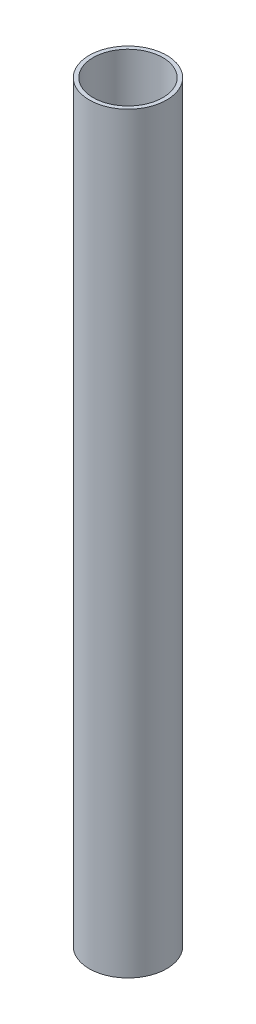
ISO-10303-21;
HEADER;
FILE_DESCRIPTION(('STEP AP214'),'2;1');
FILE_NAME('part.step','',(''),(''),'','','');
FILE_SCHEMA(('AUTOMOTIVE_DESIGN { 1 0 10303 214 1 1 1 1 }'));
ENDSEC;
DATA;
#1=APPLICATION_CONTEXT('core data for automotive mechanical design processes');
#2=APPLICATION_PROTOCOL_DEFINITION('international standard','automotive_design',2000,#1);
#3=PRODUCT_CONTEXT('',#1,'mechanical');
#4=PRODUCT('Part','Part','',(#3));
#5=PRODUCT_RELATED_PRODUCT_CATEGORY('part','',(#4));
#6=PRODUCT_DEFINITION_FORMATION('','',#4);
#7=PRODUCT_DEFINITION_CONTEXT('part definition',#1,'design');
#8=PRODUCT_DEFINITION('design','',#6,#7);
#9=PRODUCT_DEFINITION_SHAPE('','',#8);
#10=(LENGTH_UNIT() NAMED_UNIT(*) SI_UNIT(.MILLI.,.METRE.));
#11=(NAMED_UNIT(*) PLANE_ANGLE_UNIT() SI_UNIT($,.RADIAN.));
#12=(NAMED_UNIT(*) SI_UNIT($,.STERADIAN.) SOLID_ANGLE_UNIT());
#13=UNCERTAINTY_MEASURE_WITH_UNIT(LENGTH_MEASURE(1.E-05),#10,'distance_accuracy_value','');
#14=(GEOMETRIC_REPRESENTATION_CONTEXT(3) GLOBAL_UNCERTAINTY_ASSIGNED_CONTEXT((#13)) GLOBAL_UNIT_ASSIGNED_CONTEXT((#10,
#11,#12)) REPRESENTATION_CONTEXT('',''));
#15=CARTESIAN_POINT('',(0.,0.,0.));
#16=DIRECTION('',(0.,0.,1.));
#17=DIRECTION('',(1.,0.,0.));
#18=AXIS2_PLACEMENT_3D('',#15,#16,#17);
#19=CARTESIAN_POINT('',(0.,240.,0.));
#20=DIRECTION('',(0.,1.,0.));
#21=DIRECTION('',(0.,0.,1.));
#22=AXIS2_PLACEMENT_3D('',#19,#20,#21);
#23=PLANE('',#22);
#24=CARTESIAN_POINT('',(0.,240.,0.));
#25=DIRECTION('',(0.,1.,0.));
#26=DIRECTION('',(0.,0.,1.));
#27=AXIS2_PLACEMENT_3D('',#24,#25,#26);
#28=CIRCLE('',#27,12.35);
#29=CARTESIAN_POINT('',(0.,240.,12.35));
#30=VERTEX_POINT('',#29);
#31=EDGE_CURVE('E10',#30,#30,#28,.T.);
#32=ORIENTED_EDGE('',*,*,#31,.T.);
#33=EDGE_LOOP('',(#32));
#34=FACE_BOUND('',#33,.T.);
#35=CARTESIAN_POINT('',(0.,240.,0.));
#36=DIRECTION('',(0.,1.,0.));
#37=DIRECTION('',(0.,0.,1.));
#38=AXIS2_PLACEMENT_3D('',#35,#36,#37);
#39=CIRCLE('',#38,11.1);
#40=CARTESIAN_POINT('',(0.,240.,11.1));
#41=VERTEX_POINT('',#40);
#42=EDGE_CURVE('E41',#41,#41,#39,.T.);
#43=ORIENTED_EDGE('',*,*,#42,.F.);
#44=EDGE_LOOP('',(#43));
#45=FACE_BOUND('',#44,.T.);
#46=ADVANCED_FACE('F30',(#34,#45),#23,.T.);
#47=CARTESIAN_POINT('',(0.,0.,0.));
#48=DIRECTION('',(0.,1.,0.));
#49=DIRECTION('',(0.,0.,1.));
#50=AXIS2_PLACEMENT_3D('',#47,#48,#49);
#51=PLANE('',#50);
#52=CARTESIAN_POINT('',(0.,0.,0.));
#53=DIRECTION('',(0.,1.,0.));
#54=DIRECTION('',(0.,0.,1.));
#55=AXIS2_PLACEMENT_3D('',#52,#53,#54);
#56=CIRCLE('',#55,12.35);
#57=CARTESIAN_POINT('',(0.,0.,12.35));
#58=VERTEX_POINT('',#57);
#59=EDGE_CURVE('E34',#58,#58,#56,.T.);
#60=ORIENTED_EDGE('',*,*,#59,.F.);
#61=EDGE_LOOP('',(#60));
#62=FACE_BOUND('',#61,.T.);
#63=CARTESIAN_POINT('',(0.,0.,0.));
#64=DIRECTION('',(0.,1.,0.));
#65=DIRECTION('',(0.,0.,1.));
#66=AXIS2_PLACEMENT_3D('',#63,#64,#65);
#67=CIRCLE('',#66,11.1);
#68=CARTESIAN_POINT('',(0.,0.,11.1));
#69=VERTEX_POINT('',#68);
#70=EDGE_CURVE('E43',#69,#69,#67,.T.);
#71=ORIENTED_EDGE('',*,*,#70,.T.);
#72=EDGE_LOOP('',(#71));
#73=FACE_BOUND('',#72,.T.);
#74=ADVANCED_FACE('F53',(#62,#73),#51,.F.);
#75=CARTESIAN_POINT('',(0.,240.,0.));
#76=DIRECTION('',(0.,-1.,0.));
#77=DIRECTION('',(0.,0.,-1.));
#78=AXIS2_PLACEMENT_3D('',#75,#76,#77);
#79=CYLINDRICAL_SURFACE('',#78,12.35);
#80=ORIENTED_EDGE('',*,*,#31,.F.);
#81=EDGE_LOOP('',(#80));
#82=FACE_BOUND('',#81,.T.);
#83=ORIENTED_EDGE('',*,*,#59,.T.);
#84=EDGE_LOOP('',(#83));
#85=FACE_BOUND('',#84,.T.);
#86=ADVANCED_FACE('F32',(#82,#85),#79,.T.);
#87=CARTESIAN_POINT('',(0.,240.,0.));
#88=DIRECTION('',(0.,-1.,0.));
#89=DIRECTION('',(0.,0.,-1.));
#90=AXIS2_PLACEMENT_3D('',#87,#88,#89);
#91=CYLINDRICAL_SURFACE('',#90,11.1);
#92=ORIENTED_EDGE('',*,*,#42,.T.);
#93=EDGE_LOOP('',(#92));
#94=FACE_BOUND('',#93,.T.);
#95=ORIENTED_EDGE('',*,*,#70,.F.);
#96=EDGE_LOOP('',(#95));
#97=FACE_BOUND('',#96,.T.);
#98=ADVANCED_FACE('F49',(#94,#97),#91,.F.);
#99=CLOSED_SHELL('',(#46,#74,#86,#98));
#100=MANIFOLD_SOLID_BREP('B2',#99);
#101=ADVANCED_BREP_SHAPE_REPRESENTATION('',(#18,#100),#14);
#102=SHAPE_DEFINITION_REPRESENTATION(#9,#101);
ENDSEC;
END-ISO-10303-21;
